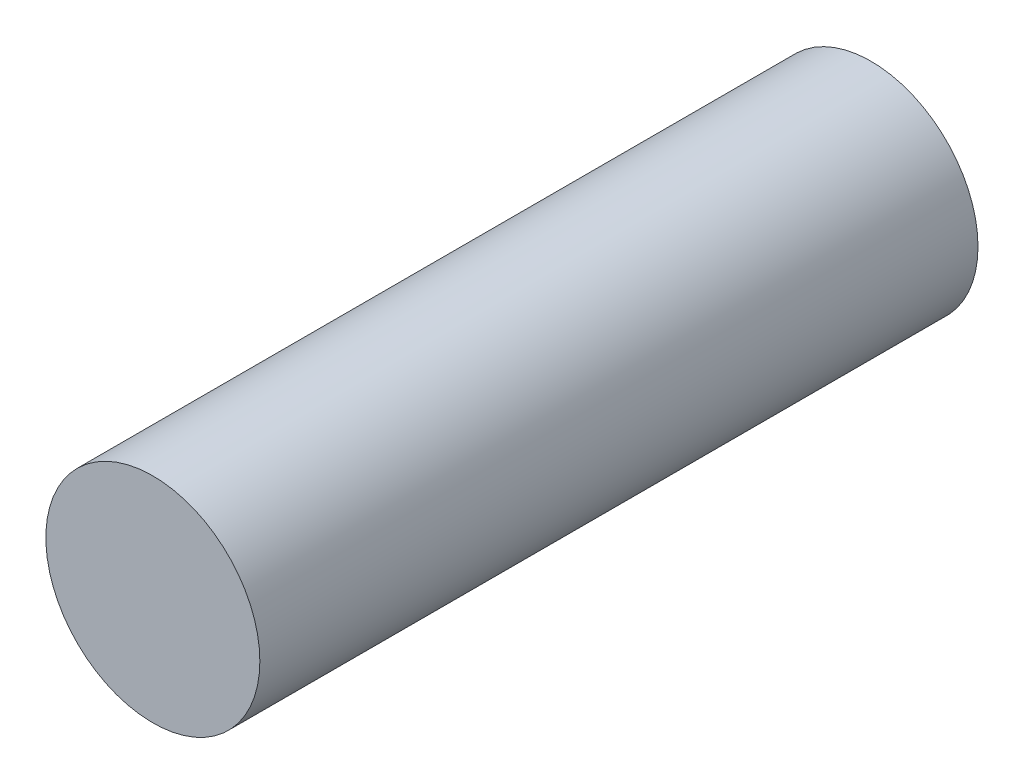
ISO-10303-21;
HEADER;
FILE_DESCRIPTION(('STEP AP214'),'2;1');
FILE_NAME('part.step','',(''),(''),'','','');
FILE_SCHEMA(('AUTOMOTIVE_DESIGN { 1 0 10303 214 1 1 1 1 }'));
ENDSEC;
DATA;
#1=APPLICATION_CONTEXT('core data for automotive mechanical design processes');
#2=APPLICATION_PROTOCOL_DEFINITION('international standard','automotive_design',2000,#1);
#3=PRODUCT_CONTEXT('',#1,'mechanical');
#4=PRODUCT('Part','Part','',(#3));
#5=PRODUCT_RELATED_PRODUCT_CATEGORY('part','',(#4));
#6=PRODUCT_DEFINITION_FORMATION('','',#4);
#7=PRODUCT_DEFINITION_CONTEXT('part definition',#1,'design');
#8=PRODUCT_DEFINITION('design','',#6,#7);
#9=PRODUCT_DEFINITION_SHAPE('','',#8);
#10=(LENGTH_UNIT() NAMED_UNIT(*) SI_UNIT(.MILLI.,.METRE.));
#11=(NAMED_UNIT(*) PLANE_ANGLE_UNIT() SI_UNIT($,.RADIAN.));
#12=(NAMED_UNIT(*) SI_UNIT($,.STERADIAN.) SOLID_ANGLE_UNIT());
#13=UNCERTAINTY_MEASURE_WITH_UNIT(LENGTH_MEASURE(1.E-05),#10,'distance_accuracy_value','');
#14=(GEOMETRIC_REPRESENTATION_CONTEXT(3) GLOBAL_UNCERTAINTY_ASSIGNED_CONTEXT((#13)) GLOBAL_UNIT_ASSIGNED_CONTEXT((#10,
#11,#12)) REPRESENTATION_CONTEXT('',''));
#15=CARTESIAN_POINT('',(0.,0.,0.));
#16=DIRECTION('',(0.,0.,1.));
#17=DIRECTION('',(1.,0.,0.));
#18=AXIS2_PLACEMENT_3D('',#15,#16,#17);
#19=CARTESIAN_POINT('',(-50.1105148472082,18.0059167520306,50.));
#20=DIRECTION('',(0.,0.,-1.));
#21=DIRECTION('',(-1.,0.,0.));
#22=AXIS2_PLACEMENT_3D('',#19,#20,#21);
#23=CYLINDRICAL_SURFACE('',#22,7.45);
#24=CARTESIAN_POINT('',(-50.1105148472082,18.0059167520306,50.));
#25=DIRECTION('',(0.,0.,1.));
#26=DIRECTION('',(1.,0.,0.));
#27=AXIS2_PLACEMENT_3D('',#24,#25,#26);
#28=CIRCLE('',#27,7.45);
#29=CARTESIAN_POINT('',(-42.6605148472082,18.0059167520306,50.));
#30=VERTEX_POINT('',#29);
#31=EDGE_CURVE('E10',#30,#30,#28,.T.);
#32=ORIENTED_EDGE('',*,*,#31,.F.);
#33=EDGE_LOOP('',(#32));
#34=FACE_BOUND('',#33,.T.);
#35=CARTESIAN_POINT('',(-50.1105148472082,18.0059167520306,0.));
#36=DIRECTION('',(0.,0.,1.));
#37=DIRECTION('',(1.,0.,0.));
#38=AXIS2_PLACEMENT_3D('',#35,#36,#37);
#39=CIRCLE('',#38,7.45);
#40=CARTESIAN_POINT('',(-42.6605148472082,18.0059167520306,0.));
#41=VERTEX_POINT('',#40);
#42=EDGE_CURVE('E40',#41,#41,#39,.T.);
#43=ORIENTED_EDGE('',*,*,#42,.T.);
#44=EDGE_LOOP('',(#43));
#45=FACE_BOUND('',#44,.T.);
#46=ADVANCED_FACE('F37',(#34,#45),#23,.T.);
#47=CARTESIAN_POINT('',(-50.1105148472082,18.0059167520306,50.));
#48=DIRECTION('',(0.,0.,1.));
#49=DIRECTION('',(1.,0.,0.));
#50=AXIS2_PLACEMENT_3D('',#47,#48,#49);
#51=PLANE('',#50);
#52=ORIENTED_EDGE('',*,*,#31,.T.);
#53=EDGE_LOOP('',(#52));
#54=FACE_BOUND('',#53,.T.);
#55=ADVANCED_FACE('F52',(#54),#51,.T.);
#56=CARTESIAN_POINT('',(-50.1105148472082,18.0059167520306,0.));
#57=DIRECTION('',(0.,0.,1.));
#58=DIRECTION('',(1.,0.,0.));
#59=AXIS2_PLACEMENT_3D('',#56,#57,#58);
#60=PLANE('',#59);
#61=ORIENTED_EDGE('',*,*,#42,.F.);
#62=EDGE_LOOP('',(#61));
#63=FACE_BOUND('',#62,.T.);
#64=ADVANCED_FACE('F50',(#63),#60,.F.);
#65=CLOSED_SHELL('',(#46,#55,#64));
#66=MANIFOLD_SOLID_BREP('B2',#65);
#67=ADVANCED_BREP_SHAPE_REPRESENTATION('',(#18,#66),#14);
#68=SHAPE_DEFINITION_REPRESENTATION(#9,#67);
ENDSEC;
END-ISO-10303-21;
